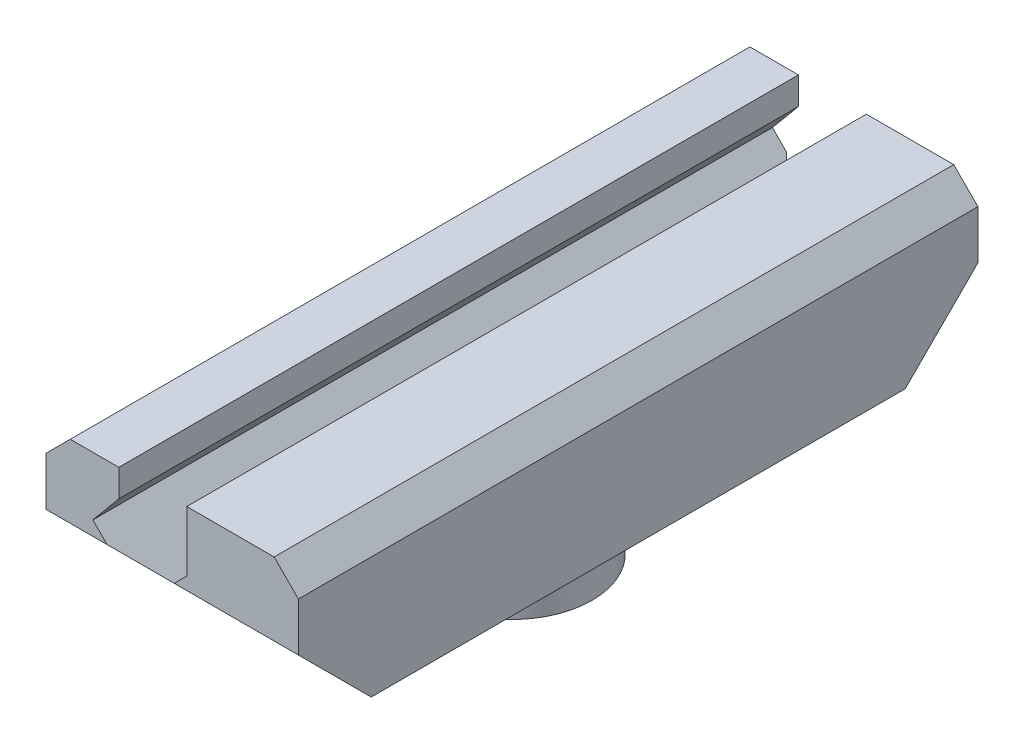
ISO-10303-21;
HEADER;
FILE_DESCRIPTION(('STEP AP214'),'2;1');
FILE_NAME('part.step','',(''),(''),'','','');
FILE_SCHEMA(('AUTOMOTIVE_DESIGN { 1 0 10303 214 1 1 1 1 }'));
ENDSEC;
DATA;
#1=APPLICATION_CONTEXT('core data for automotive mechanical design processes');
#2=APPLICATION_PROTOCOL_DEFINITION('international standard','automotive_design',2000,#1);
#3=PRODUCT_CONTEXT('',#1,'mechanical');
#4=PRODUCT('Part','Part','',(#3));
#5=PRODUCT_RELATED_PRODUCT_CATEGORY('part','',(#4));
#6=PRODUCT_DEFINITION_FORMATION('','',#4);
#7=PRODUCT_DEFINITION_CONTEXT('part definition',#1,'design');
#8=PRODUCT_DEFINITION('design','',#6,#7);
#9=PRODUCT_DEFINITION_SHAPE('','',#8);
#10=(LENGTH_UNIT() NAMED_UNIT(*) SI_UNIT(.MILLI.,.METRE.));
#11=(NAMED_UNIT(*) PLANE_ANGLE_UNIT() SI_UNIT($,.RADIAN.));
#12=(NAMED_UNIT(*) SI_UNIT($,.STERADIAN.) SOLID_ANGLE_UNIT());
#13=UNCERTAINTY_MEASURE_WITH_UNIT(LENGTH_MEASURE(1.E-05),#10,'distance_accuracy_value','');
#14=(GEOMETRIC_REPRESENTATION_CONTEXT(3) GLOBAL_UNCERTAINTY_ASSIGNED_CONTEXT((#13)) GLOBAL_UNIT_ASSIGNED_CONTEXT((#10,
#11,#12)) REPRESENTATION_CONTEXT('',''));
#15=CARTESIAN_POINT('',(0.,0.,0.));
#16=DIRECTION('',(0.,0.,1.));
#17=DIRECTION('',(1.,0.,0.));
#18=AXIS2_PLACEMENT_3D('',#15,#16,#17);
#19=CARTESIAN_POINT('',(102.,-9.,0.));
#20=DIRECTION('',(0.,1.,0.));
#21=DIRECTION('',(1.,0.,0.));
#22=AXIS2_PLACEMENT_3D('',#19,#20,#21);
#23=PLANE('',#22);
#24=CARTESIAN_POINT('',(102.,-9.,0.));
#25=DIRECTION('',(0.,-1.,0.));
#26=DIRECTION('',(0.,0.,1.));
#27=AXIS2_PLACEMENT_3D('',#24,#25,#26);
#28=CIRCLE('',#27,9.9);
#29=CARTESIAN_POINT('',(102.,-9.,-9.9));
#30=VERTEX_POINT('',#29);
#31=EDGE_CURVE('E25',#30,#30,#28,.T.);
#32=ORIENTED_EDGE('',*,*,#31,.T.);
#33=EDGE_LOOP('',(#32));
#34=FACE_BOUND('',#33,.T.);
#35=ADVANCED_FACE('F16',(#34),#23,.F.);
#36=CARTESIAN_POINT('',(102.,0.,0.));
#37=DIRECTION('',(0.,-1.,0.));
#38=DIRECTION('',(0.,0.,1.));
#39=AXIS2_PLACEMENT_3D('',#36,#37,#38);
#40=CYLINDRICAL_SURFACE('',#39,9.9);
#41=ORIENTED_EDGE('',*,*,#31,.F.);
#42=DIRECTION('',(0.,1.,0.));
#43=VECTOR('',#42,1.);
#44=CARTESIAN_POINT('',(102.,0.,-9.9));
#45=LINE('',#44,#43);
#46=CARTESIAN_POINT('',(102.,0.,-9.9));
#47=VERTEX_POINT('',#46);
#48=EDGE_CURVE('E10',#30,#47,#45,.T.);
#49=ORIENTED_EDGE('',*,*,#48,.T.);
#50=CARTESIAN_POINT('',(102.,0.,0.));
#51=DIRECTION('',(0.,1.,0.));
#52=DIRECTION('',(0.,0.,1.));
#53=AXIS2_PLACEMENT_3D('',#50,#51,#52);
#54=CIRCLE('',#53,9.9);
#55=EDGE_CURVE('E206',#47,#47,#54,.T.);
#56=ORIENTED_EDGE('',*,*,#55,.F.);
#57=ORIENTED_EDGE('',*,*,#48,.F.);
#58=EDGE_LOOP('',(#41,#49,#56,#57));
#59=FACE_BOUND('',#58,.T.);
#60=ADVANCED_FACE('F204',(#59),#40,.T.);
#61=CARTESIAN_POINT('',(117.6,0.,-42.));
#62=DIRECTION('',(0.,0.,-1.));
#63=DIRECTION('',(0.,-1.,0.));
#64=AXIS2_PLACEMENT_3D('',#61,#62,#63);
#65=PLANE('',#64);
#66=DIRECTION('',(-0.707106781186548,-0.707106781186548,0.));
#67=VECTOR('',#66,1.);
#68=CARTESIAN_POINT('',(91.2,19.8,-42.));
#69=LINE('',#68,#67);
#70=CARTESIAN_POINT('',(89.4,18.,-42.));
#71=VERTEX_POINT('',#70);
#72=CARTESIAN_POINT('',(86.4,15.,-42.));
#73=VERTEX_POINT('',#72);
#74=EDGE_CURVE('E299',#71,#73,#69,.T.);
#75=ORIENTED_EDGE('',*,*,#74,.F.);
#76=DIRECTION('',(-1.,0.,0.));
#77=VECTOR('',#76,1.);
#78=CARTESIAN_POINT('',(117.6,18.,-42.));
#79=LINE('',#78,#77);
#80=CARTESIAN_POINT('',(95.4,18.0000000894069,-42.));
#81=VERTEX_POINT('',#80);
#82=EDGE_CURVE('E169',#81,#71,#79,.T.);
#83=ORIENTED_EDGE('',*,*,#82,.F.);
#84=DIRECTION('',(0.,-1.,0.));
#85=VECTOR('',#84,1.);
#86=CARTESIAN_POINT('',(95.4,9.00000004470348,-42.));
#87=LINE('',#86,#85);
#88=CARTESIAN_POINT('',(95.4,14.6172300078845,-42.));
#89=VERTEX_POINT('',#88);
#90=EDGE_CURVE('E159',#81,#89,#87,.T.);
#91=ORIENTED_EDGE('',*,*,#90,.T.);
#92=DIRECTION('',(-0.640184404356033,-0.768221275687748,0.));
#93=VECTOR('',#92,1.);
#94=CARTESIAN_POINT('',(96.354779564886,15.7629654715204,-42.));
#95=LINE('',#94,#93);
#96=CARTESIAN_POINT('',(92.1882917710182,10.7631801809648,-42.));
#97=VERTEX_POINT('',#96);
#98=EDGE_CURVE('E167',#89,#97,#95,.T.);
#99=ORIENTED_EDGE('',*,*,#98,.T.);
#100=DIRECTION('',(0.707106781186548,-0.707106781186547,0.));
#101=VECTOR('',#100,1.);
#102=CARTESIAN_POINT('',(101.232013873505,1.71945807847817,-42.));
#103=LINE('',#102,#101);
#104=CARTESIAN_POINT('',(93.9514719519834,9.,-42.));
#105=VERTEX_POINT('',#104);
#106=EDGE_CURVE('E306',#97,#105,#103,.T.);
#107=ORIENTED_EDGE('',*,*,#106,.T.);
#108=DIRECTION('',(1.,0.,0.));
#109=VECTOR('',#108,1.);
#110=CARTESIAN_POINT('',(109.8,9.,-42.));
#111=LINE('',#110,#109);
#112=CARTESIAN_POINT('',(86.4,9.,-42.));
#113=VERTEX_POINT('',#112);
#114=EDGE_CURVE('E215',#113,#105,#111,.T.);
#115=ORIENTED_EDGE('',*,*,#114,.F.);
#116=DIRECTION('',(0.,1.,0.));
#117=VECTOR('',#116,1.);
#118=CARTESIAN_POINT('',(86.4,0.,-42.));
#119=LINE('',#118,#117);
#120=EDGE_CURVE('E317',#113,#73,#119,.T.);
#121=ORIENTED_EDGE('',*,*,#120,.T.);
#122=EDGE_LOOP('',(#75,#83,#91,#99,#107,#115,#121));
#123=FACE_BOUND('',#122,.T.);
#124=ADVANCED_FACE('F162',(#123),#65,.T.);
#125=CARTESIAN_POINT('',(102.,18.,0.));
#126=DIRECTION('',(0.,1.,0.));
#127=DIRECTION('',(1.,0.,0.));
#128=AXIS2_PLACEMENT_3D('',#125,#126,#127);
#129=PLANE('',#128);
#130=DIRECTION('',(0.,0.,-1.));
#131=VECTOR('',#130,1.);
#132=CARTESIAN_POINT('',(89.4,18.,-21.));
#133=LINE('',#132,#131);
#134=CARTESIAN_POINT('',(89.4,18.,42.));
#135=VERTEX_POINT('',#134);
#136=EDGE_CURVE('E304',#135,#71,#133,.T.);
#137=ORIENTED_EDGE('',*,*,#136,.F.);
#138=DIRECTION('',(1.,0.,0.));
#139=VECTOR('',#138,1.);
#140=CARTESIAN_POINT('',(86.4,18.,42.));
#141=LINE('',#140,#139);
#142=CARTESIAN_POINT('',(95.4,18.0000000894069,42.));
#143=VERTEX_POINT('',#142);
#144=EDGE_CURVE('E312',#135,#143,#141,.T.);
#145=ORIENTED_EDGE('',*,*,#144,.T.);
#146=DIRECTION('',(0.,0.,-1.));
#147=VECTOR('',#146,1.);
#148=CARTESIAN_POINT('',(95.4,18.,-21.));
#149=LINE('',#148,#147);
#150=EDGE_CURVE('E172',#143,#81,#149,.T.);
#151=ORIENTED_EDGE('',*,*,#150,.T.);
#152=ORIENTED_EDGE('',*,*,#82,.T.);
#153=EDGE_LOOP('',(#137,#145,#151,#152));
#154=FACE_BOUND('',#153,.T.);
#155=ADVANCED_FACE('F680',(#154),#129,.T.);
#156=CARTESIAN_POINT('',(102.,18.,0.));
#157=DIRECTION('',(0.,1.,0.));
#158=DIRECTION('',(1.,0.,0.));
#159=AXIS2_PLACEMENT_3D('',#156,#157,#158);
#160=PLANE('',#159);
#161=DIRECTION('',(0.,0.,1.));
#162=VECTOR('',#161,1.);
#163=CARTESIAN_POINT('',(114.6,18.,21.));
#164=LINE('',#163,#162);
#165=CARTESIAN_POINT('',(114.6,18.,-42.));
#166=VERTEX_POINT('',#165);
#167=CARTESIAN_POINT('',(114.6,18.,42.));
#168=VERTEX_POINT('',#167);
#169=EDGE_CURVE('E233',#166,#168,#164,.T.);
#170=ORIENTED_EDGE('',*,*,#169,.F.);
#171=DIRECTION('',(-1.,0.,0.));
#172=VECTOR('',#171,1.);
#173=CARTESIAN_POINT('',(117.6,18.,-42.));
#174=LINE('',#173,#172);
#175=CARTESIAN_POINT('',(103.8,18.,-42.));
#176=VERTEX_POINT('',#175);
#177=EDGE_CURVE('E194',#166,#176,#174,.T.);
#178=ORIENTED_EDGE('',*,*,#177,.T.);
#179=DIRECTION('',(0.,0.,1.));
#180=VECTOR('',#179,1.);
#181=CARTESIAN_POINT('',(103.8,18.,-21.));
#182=LINE('',#181,#180);
#183=CARTESIAN_POINT('',(103.8,18.,42.));
#184=VERTEX_POINT('',#183);
#185=EDGE_CURVE('E187',#176,#184,#182,.T.);
#186=ORIENTED_EDGE('',*,*,#185,.T.);
#187=DIRECTION('',(1.,0.,0.));
#188=VECTOR('',#187,1.);
#189=CARTESIAN_POINT('',(86.4,18.,42.));
#190=LINE('',#189,#188);
#191=EDGE_CURVE('E251',#184,#168,#190,.T.);
#192=ORIENTED_EDGE('',*,*,#191,.T.);
#193=EDGE_LOOP('',(#170,#178,#186,#192));
#194=FACE_BOUND('',#193,.T.);
#195=ADVANCED_FACE('F230',(#194),#160,.T.);
#196=CARTESIAN_POINT('',(95.4,18.0000000894069,-42.));
#197=DIRECTION('',(-1.,0.,0.));
#198=DIRECTION('',(0.,0.,1.));
#199=AXIS2_PLACEMENT_3D('',#196,#197,#198);
#200=PLANE('',#199);
#201=ORIENTED_EDGE('',*,*,#90,.F.);
#202=ORIENTED_EDGE('',*,*,#150,.F.);
#203=DIRECTION('',(0.,1.,0.));
#204=VECTOR('',#203,1.);
#205=CARTESIAN_POINT('',(95.4,9.00000004470348,42.));
#206=LINE('',#205,#204);
#207=CARTESIAN_POINT('',(95.4,14.6172300078845,42.));
#208=VERTEX_POINT('',#207);
#209=EDGE_CURVE('E178',#208,#143,#206,.T.);
#210=ORIENTED_EDGE('',*,*,#209,.F.);
#211=DIRECTION('',(0.,0.,1.));
#212=VECTOR('',#211,1.);
#213=CARTESIAN_POINT('',(95.4,14.6172300078845,-42.));
#214=LINE('',#213,#212);
#215=EDGE_CURVE('E174',#89,#208,#214,.T.);
#216=ORIENTED_EDGE('',*,*,#215,.F.);
#217=EDGE_LOOP('',(#201,#202,#210,#216));
#218=FACE_BOUND('',#217,.T.);
#219=ADVANCED_FACE('F176',(#218),#200,.F.);
#220=CARTESIAN_POINT('',(95.4,14.6172300078845,-42.));
#221=DIRECTION('',(-0.768221275687748,0.640184404356033,0.));
#222=DIRECTION('',(0.,0.,1.));
#223=AXIS2_PLACEMENT_3D('',#220,#221,#222);
#224=PLANE('',#223);
#225=ORIENTED_EDGE('',*,*,#98,.F.);
#226=ORIENTED_EDGE('',*,*,#215,.T.);
#227=DIRECTION('',(0.640184404356033,0.768221275687748,0.));
#228=VECTOR('',#227,1.);
#229=CARTESIAN_POINT('',(89.9613368482272,8.0908343067996,42.));
#230=LINE('',#229,#228);
#231=CARTESIAN_POINT('',(92.1882917710182,10.7631801809648,42.));
#232=VERTEX_POINT('',#231);
#233=EDGE_CURVE('E330',#232,#208,#230,.T.);
#234=ORIENTED_EDGE('',*,*,#233,.F.);
#235=DIRECTION('',(0.,0.,1.));
#236=VECTOR('',#235,1.);
#237=CARTESIAN_POINT('',(92.1882917710182,10.7631801809648,-42.));
#238=LINE('',#237,#236);
#239=EDGE_CURVE('E184',#97,#232,#238,.T.);
#240=ORIENTED_EDGE('',*,*,#239,.F.);
#241=EDGE_LOOP('',(#225,#226,#234,#240));
#242=FACE_BOUND('',#241,.T.);
#243=ADVANCED_FACE('F182',(#242),#224,.F.);
#244=CARTESIAN_POINT('',(103.8,10.5514719519832,-42.));
#245=DIRECTION('',(1.,0.,0.));
#246=DIRECTION('',(0.,0.,1.));
#247=AXIS2_PLACEMENT_3D('',#244,#245,#246);
#248=PLANE('',#247);
#249=DIRECTION('',(0.,1.,0.));
#250=VECTOR('',#249,1.);
#251=CARTESIAN_POINT('',(103.8,5.27573597599157,-42.));
#252=LINE('',#251,#250);
#253=CARTESIAN_POINT('',(103.8,10.5514719519832,-42.));
#254=VERTEX_POINT('',#253);
#255=EDGE_CURVE('E211',#254,#176,#252,.T.);
#256=ORIENTED_EDGE('',*,*,#255,.F.);
#257=DIRECTION('',(0.,0.,1.));
#258=VECTOR('',#257,1.);
#259=CARTESIAN_POINT('',(103.8,10.5514719519832,-42.));
#260=LINE('',#259,#258);
#261=CARTESIAN_POINT('',(103.8,10.5514719519832,42.));
#262=VERTEX_POINT('',#261);
#263=EDGE_CURVE('E243',#254,#262,#260,.T.);
#264=ORIENTED_EDGE('',*,*,#263,.T.);
#265=DIRECTION('',(0.,-1.,0.));
#266=VECTOR('',#265,1.);
#267=CARTESIAN_POINT('',(103.8,5.27573597599157,42.));
#268=LINE('',#267,#266);
#269=EDGE_CURVE('E250',#184,#262,#268,.T.);
#270=ORIENTED_EDGE('',*,*,#269,.F.);
#271=ORIENTED_EDGE('',*,*,#185,.F.);
#272=EDGE_LOOP('',(#256,#264,#270,#271));
#273=FACE_BOUND('',#272,.T.);
#274=ADVANCED_FACE('F242',(#273),#248,.F.);
#275=CARTESIAN_POINT('',(117.6,0.,-42.));
#276=DIRECTION('',(0.,0.,-1.));
#277=DIRECTION('',(0.,-1.,0.));
#278=AXIS2_PLACEMENT_3D('',#275,#276,#277);
#279=PLANE('',#278);
#280=DIRECTION('',(-0.707106781186548,0.707106781186548,0.));
#281=VECTOR('',#280,1.);
#282=CARTESIAN_POINT('',(120.6,12.,-42.));
#283=LINE('',#282,#281);
#284=CARTESIAN_POINT('',(117.6,15.,-42.));
#285=VERTEX_POINT('',#284);
#286=EDGE_CURVE('E267',#285,#166,#283,.T.);
#287=ORIENTED_EDGE('',*,*,#286,.F.);
#288=DIRECTION('',(0.,1.,0.));
#289=VECTOR('',#288,1.);
#290=CARTESIAN_POINT('',(117.6,0.,-42.));
#291=LINE('',#290,#289);
#292=CARTESIAN_POINT('',(117.6,9.,-42.));
#293=VERTEX_POINT('',#292);
#294=EDGE_CURVE('E257',#293,#285,#291,.T.);
#295=ORIENTED_EDGE('',*,*,#294,.F.);
#296=DIRECTION('',(1.,0.,0.));
#297=VECTOR('',#296,1.);
#298=CARTESIAN_POINT('',(109.8,9.,-42.));
#299=LINE('',#298,#297);
#300=CARTESIAN_POINT('',(102.248528048017,9.,-42.));
#301=VERTEX_POINT('',#300);
#302=EDGE_CURVE('E379',#301,#293,#299,.T.);
#303=ORIENTED_EDGE('',*,*,#302,.F.);
#304=DIRECTION('',(0.707106781186548,0.707106781186547,0.));
#305=VECTOR('',#304,1.);
#306=CARTESIAN_POINT('',(101.762132012004,8.51360396398734,-42.));
#307=LINE('',#306,#305);
#308=EDGE_CURVE('E239',#301,#254,#307,.T.);
#309=ORIENTED_EDGE('',*,*,#308,.T.);
#310=ORIENTED_EDGE('',*,*,#255,.T.);
#311=ORIENTED_EDGE('',*,*,#177,.F.);
#312=EDGE_LOOP('',(#287,#295,#303,#309,#310,#311));
#313=FACE_BOUND('',#312,.T.);
#314=ADVANCED_FACE('F238',(#313),#279,.T.);
#315=CARTESIAN_POINT('',(102.,0.,0.));
#316=DIRECTION('',(0.,1.,0.));
#317=DIRECTION('',(1.,0.,0.));
#318=AXIS2_PLACEMENT_3D('',#315,#316,#317);
#319=PLANE('',#318);
#320=ORIENTED_EDGE('',*,*,#55,.T.);
#321=EDGE_LOOP('',(#320));
#322=FACE_BOUND('',#321,.T.);
#323=DIRECTION('',(1.,0.,0.));
#324=VECTOR('',#323,1.);
#325=CARTESIAN_POINT('',(94.2,0.,33.));
#326=LINE('',#325,#324);
#327=CARTESIAN_POINT('',(86.4,0.,33.));
#328=VERTEX_POINT('',#327);
#329=CARTESIAN_POINT('',(117.6,0.,33.));
#330=VERTEX_POINT('',#329);
#331=EDGE_CURVE('E356',#328,#330,#326,.T.);
#332=ORIENTED_EDGE('',*,*,#331,.F.);
#333=DIRECTION('',(0.,0.,1.));
#334=VECTOR('',#333,1.);
#335=CARTESIAN_POINT('',(86.4,0.,-42.));
#336=LINE('',#335,#334);
#337=CARTESIAN_POINT('',(86.4,0.,-33.));
#338=VERTEX_POINT('',#337);
#339=EDGE_CURVE('E337',#338,#328,#336,.T.);
#340=ORIENTED_EDGE('',*,*,#339,.F.);
#341=DIRECTION('',(-1.,0.,0.));
#342=VECTOR('',#341,1.);
#343=CARTESIAN_POINT('',(109.8,0.,-33.));
#344=LINE('',#343,#342);
#345=CARTESIAN_POINT('',(117.6,0.,-33.));
#346=VERTEX_POINT('',#345);
#347=EDGE_CURVE('E219',#346,#338,#344,.T.);
#348=ORIENTED_EDGE('',*,*,#347,.F.);
#349=DIRECTION('',(0.,0.,-1.));
#350=VECTOR('',#349,1.);
#351=CARTESIAN_POINT('',(117.6,0.,42.));
#352=LINE('',#351,#350);
#353=EDGE_CURVE('E272',#330,#346,#352,.T.);
#354=ORIENTED_EDGE('',*,*,#353,.F.);
#355=EDGE_LOOP('',(#332,#340,#348,#354));
#356=FACE_BOUND('',#355,.T.);
#357=ADVANCED_FACE('F208',(#322,#356),#319,.F.);
#358=CARTESIAN_POINT('',(109.8,4.5,-37.5));
#359=DIRECTION('',(0.,-0.707106781186548,-0.707106781186548));
#360=DIRECTION('',(0.,-0.707106781186548,0.707106781186548));
#361=AXIS2_PLACEMENT_3D('',#358,#359,#360);
#362=PLANE('',#361);
#363=DIRECTION('',(0.577350269189627,0.577350269189626,-0.577350269189625));
#364=VECTOR('',#363,1.);
#365=CARTESIAN_POINT('',(100.624264024009,7.37573597599158,-40.3757359759917));
#366=LINE('',#365,#364);
#367=CARTESIAN_POINT('',(98.1,4.85147195198314,-37.8514719519832));
#368=VERTEX_POINT('',#367);
#369=EDGE_CURVE('E362',#368,#301,#366,.T.);
#370=ORIENTED_EDGE('',*,*,#369,.T.);
#371=ORIENTED_EDGE('',*,*,#302,.T.);
#372=DIRECTION('',(0.,-0.707106781186548,0.707106781186548));
#373=VECTOR('',#372,1.);
#374=CARTESIAN_POINT('',(117.6,-16.5,-16.5));
#375=LINE('',#374,#373);
#376=EDGE_CURVE('E266',#293,#346,#375,.T.);
#377=ORIENTED_EDGE('',*,*,#376,.T.);
#378=ORIENTED_EDGE('',*,*,#347,.T.);
#379=DIRECTION('',(0.,0.707106781186548,-0.707106781186548));
#380=VECTOR('',#379,1.);
#381=CARTESIAN_POINT('',(86.4,4.5,-37.5));
#382=LINE('',#381,#380);
#383=EDGE_CURVE('E345',#338,#113,#382,.T.);
#384=ORIENTED_EDGE('',*,*,#383,.T.);
#385=ORIENTED_EDGE('',*,*,#114,.T.);
#386=DIRECTION('',(0.577350269189626,-0.577350269189626,0.577350269189626));
#387=VECTOR('',#386,1.);
#388=CARTESIAN_POINT('',(97.505166566331,5.44630538565211,-38.4463053856522));
#389=LINE('',#388,#387);
#390=EDGE_CURVE('E369',#105,#368,#389,.T.);
#391=ORIENTED_EDGE('',*,*,#390,.T.);
#392=EDGE_LOOP('',(#370,#371,#377,#378,#384,#385,#391));
#393=FACE_BOUND('',#392,.T.);
#394=ADVANCED_FACE('F390',(#393),#362,.T.);
#395=CARTESIAN_POINT('',(98.1,4.85147195198314,-42.));
#396=DIRECTION('',(0.707106781186547,-0.707106781186548,0.));
#397=DIRECTION('',(0.,0.,-1.));
#398=AXIS2_PLACEMENT_3D('',#395,#396,#397);
#399=PLANE('',#398);
#400=DIRECTION('',(-0.577350269189626,-0.577350269189626,-0.577350269189625));
#401=VECTOR('',#400,1.);
#402=CARTESIAN_POINT('',(84.0242640240084,-9.22426402400844,23.7757359759915));
#403=LINE('',#402,#401);
#404=CARTESIAN_POINT('',(102.248528048017,9.,42.));
#405=VERTEX_POINT('',#404);
#406=CARTESIAN_POINT('',(98.1,4.85147195198314,37.8514719519831));
#407=VERTEX_POINT('',#406);
#408=EDGE_CURVE('E357',#405,#407,#403,.T.);
#409=ORIENTED_EDGE('',*,*,#408,.F.);
#410=DIRECTION('',(-0.707106781186548,-0.707106781186547,0.));
#411=VECTOR('',#410,1.);
#412=CARTESIAN_POINT('',(93.962132012004,0.713603963987358,42.));
#413=LINE('',#412,#411);
#414=EDGE_CURVE('E252',#262,#405,#413,.T.);
#415=ORIENTED_EDGE('',*,*,#414,.F.);
#416=ORIENTED_EDGE('',*,*,#263,.F.);
#417=ORIENTED_EDGE('',*,*,#308,.F.);
#418=ORIENTED_EDGE('',*,*,#369,.F.);
#419=DIRECTION('',(0.,0.,1.));
#420=VECTOR('',#419,1.);
#421=CARTESIAN_POINT('',(98.1,4.85147195198314,-42.));
#422=LINE('',#421,#420);
#423=EDGE_CURVE('E368',#368,#407,#422,.T.);
#424=ORIENTED_EDGE('',*,*,#423,.T.);
#425=EDGE_LOOP('',(#409,#415,#416,#417,#418,#424));
#426=FACE_BOUND('',#425,.T.);
#427=ADVANCED_FACE('F403',(#426),#399,.F.);
#428=CARTESIAN_POINT('',(92.1882917710182,10.7631801809648,-42.));
#429=DIRECTION('',(-0.707106781186547,-0.707106781186548,0.));
#430=DIRECTION('',(-0.707106781186548,0.707106781186547,0.));
#431=AXIS2_PLACEMENT_3D('',#428,#429,#430);
#432=PLANE('',#431);
#433=DIRECTION('',(-0.577350269189626,0.577350269189626,0.577350269189625));
#434=VECTOR('',#433,1.);
#435=CARTESIAN_POINT('',(108.905166566331,-5.95369461434788,27.0463053856521));
#436=LINE('',#435,#434);
#437=CARTESIAN_POINT('',(93.9514719519834,9.,42.));
#438=VERTEX_POINT('',#437);
#439=EDGE_CURVE('E352',#407,#438,#436,.T.);
#440=ORIENTED_EDGE('',*,*,#439,.F.);
#441=ORIENTED_EDGE('',*,*,#423,.F.);
#442=ORIENTED_EDGE('',*,*,#390,.F.);
#443=ORIENTED_EDGE('',*,*,#106,.F.);
#444=ORIENTED_EDGE('',*,*,#239,.T.);
#445=DIRECTION('',(-0.707106781186548,0.707106781186547,0.));
#446=VECTOR('',#445,1.);
#447=CARTESIAN_POINT('',(93.4320138735048,9.51945807847818,42.));
#448=LINE('',#447,#446);
#449=EDGE_CURVE('E329',#438,#232,#448,.T.);
#450=ORIENTED_EDGE('',*,*,#449,.F.);
#451=EDGE_LOOP('',(#440,#441,#442,#443,#444,#450));
#452=FACE_BOUND('',#451,.T.);
#453=ADVANCED_FACE('F397',(#452),#432,.F.);
#454=CARTESIAN_POINT('',(94.2,4.5,37.5));
#455=DIRECTION('',(0.,-0.707106781186547,0.707106781186548));
#456=DIRECTION('',(-1.,0.,0.));
#457=AXIS2_PLACEMENT_3D('',#454,#455,#456);
#458=PLANE('',#457);
#459=ORIENTED_EDGE('',*,*,#439,.T.);
#460=DIRECTION('',(-1.,0.,0.));
#461=VECTOR('',#460,1.);
#462=CARTESIAN_POINT('',(94.2,9.,42.));
#463=LINE('',#462,#461);
#464=CARTESIAN_POINT('',(86.4,9.,42.));
#465=VERTEX_POINT('',#464);
#466=EDGE_CURVE('E326',#438,#465,#463,.T.);
#467=ORIENTED_EDGE('',*,*,#466,.T.);
#468=DIRECTION('',(0.,-0.707106781186548,-0.707106781186547));
#469=VECTOR('',#468,1.);
#470=CARTESIAN_POINT('',(86.4,-16.5,16.5));
#471=LINE('',#470,#469);
#472=EDGE_CURVE('E341',#465,#328,#471,.T.);
#473=ORIENTED_EDGE('',*,*,#472,.T.);
#474=ORIENTED_EDGE('',*,*,#331,.T.);
#475=DIRECTION('',(0.,0.707106781186548,0.707106781186547));
#476=VECTOR('',#475,1.);
#477=CARTESIAN_POINT('',(117.6,4.5,37.5));
#478=LINE('',#477,#476);
#479=CARTESIAN_POINT('',(117.6,9.,42.));
#480=VERTEX_POINT('',#479);
#481=EDGE_CURVE('E280',#330,#480,#478,.T.);
#482=ORIENTED_EDGE('',*,*,#481,.T.);
#483=DIRECTION('',(-1.,0.,0.));
#484=VECTOR('',#483,1.);
#485=CARTESIAN_POINT('',(94.2,9.,42.));
#486=LINE('',#485,#484);
#487=EDGE_CURVE('E285',#480,#405,#486,.T.);
#488=ORIENTED_EDGE('',*,*,#487,.T.);
#489=ORIENTED_EDGE('',*,*,#408,.T.);
#490=EDGE_LOOP('',(#459,#467,#473,#474,#482,#488,#489));
#491=FACE_BOUND('',#490,.T.);
#492=ADVANCED_FACE('F404',(#491),#458,.T.);
#493=CARTESIAN_POINT('',(86.4,0.,-42.));
#494=DIRECTION('',(-1.,0.,0.));
#495=DIRECTION('',(0.,0.,1.));
#496=AXIS2_PLACEMENT_3D('',#493,#494,#495);
#497=PLANE('',#496);
#498=DIRECTION('',(0.,0.,1.));
#499=VECTOR('',#498,1.);
#500=CARTESIAN_POINT('',(86.4,15.,-21.));
#501=LINE('',#500,#499);
#502=CARTESIAN_POINT('',(86.4,15.,42.));
#503=VERTEX_POINT('',#502);
#504=EDGE_CURVE('E302',#73,#503,#501,.T.);
#505=ORIENTED_EDGE('',*,*,#504,.F.);
#506=ORIENTED_EDGE('',*,*,#120,.F.);
#507=ORIENTED_EDGE('',*,*,#383,.F.);
#508=ORIENTED_EDGE('',*,*,#339,.T.);
#509=ORIENTED_EDGE('',*,*,#472,.F.);
#510=DIRECTION('',(0.,1.,0.));
#511=VECTOR('',#510,1.);
#512=CARTESIAN_POINT('',(86.4,0.,42.));
#513=LINE('',#512,#511);
#514=EDGE_CURVE('E323',#465,#503,#513,.T.);
#515=ORIENTED_EDGE('',*,*,#514,.T.);
#516=EDGE_LOOP('',(#505,#506,#507,#508,#509,#515));
#517=FACE_BOUND('',#516,.T.);
#518=ADVANCED_FACE('F393',(#517),#497,.T.);
#519=CARTESIAN_POINT('',(86.4,0.,42.));
#520=DIRECTION('',(0.,0.,1.));
#521=DIRECTION('',(1.,0.,0.));
#522=AXIS2_PLACEMENT_3D('',#519,#520,#521);
#523=PLANE('',#522);
#524=DIRECTION('',(0.707106781186548,0.707106781186548,0.));
#525=VECTOR('',#524,1.);
#526=CARTESIAN_POINT('',(83.4,12.,42.));
#527=LINE('',#526,#525);
#528=EDGE_CURVE('E287',#503,#135,#527,.T.);
#529=ORIENTED_EDGE('',*,*,#528,.F.);
#530=ORIENTED_EDGE('',*,*,#514,.F.);
#531=ORIENTED_EDGE('',*,*,#466,.F.);
#532=ORIENTED_EDGE('',*,*,#449,.T.);
#533=ORIENTED_EDGE('',*,*,#233,.T.);
#534=ORIENTED_EDGE('',*,*,#209,.T.);
#535=ORIENTED_EDGE('',*,*,#144,.F.);
#536=EDGE_LOOP('',(#529,#530,#531,#532,#533,#534,#535));
#537=FACE_BOUND('',#536,.T.);
#538=ADVANCED_FACE('F619',(#537),#523,.T.);
#539=CARTESIAN_POINT('',(87.9,16.5,-21.));
#540=DIRECTION('',(-0.707106781186548,0.707106781186548,0.));
#541=DIRECTION('',(0.,0.,1.));
#542=AXIS2_PLACEMENT_3D('',#539,#540,#541);
#543=PLANE('',#542);
#544=ORIENTED_EDGE('',*,*,#528,.T.);
#545=ORIENTED_EDGE('',*,*,#136,.T.);
#546=ORIENTED_EDGE('',*,*,#74,.T.);
#547=ORIENTED_EDGE('',*,*,#504,.T.);
#548=EDGE_LOOP('',(#544,#545,#546,#547));
#549=FACE_BOUND('',#548,.T.);
#550=ADVANCED_FACE('F582',(#549),#543,.T.);
#551=CARTESIAN_POINT('',(86.4,0.,42.));
#552=DIRECTION('',(0.,0.,1.));
#553=DIRECTION('',(1.,0.,0.));
#554=AXIS2_PLACEMENT_3D('',#551,#552,#553);
#555=PLANE('',#554);
#556=DIRECTION('',(0.707106781186548,-0.707106781186548,0.));
#557=VECTOR('',#556,1.);
#558=CARTESIAN_POINT('',(112.8,19.8,42.));
#559=LINE('',#558,#557);
#560=CARTESIAN_POINT('',(117.6,15.,42.));
#561=VERTEX_POINT('',#560);
#562=EDGE_CURVE('E256',#168,#561,#559,.T.);
#563=ORIENTED_EDGE('',*,*,#562,.F.);
#564=ORIENTED_EDGE('',*,*,#191,.F.);
#565=ORIENTED_EDGE('',*,*,#269,.T.);
#566=ORIENTED_EDGE('',*,*,#414,.T.);
#567=ORIENTED_EDGE('',*,*,#487,.F.);
#568=DIRECTION('',(0.,1.,0.));
#569=VECTOR('',#568,1.);
#570=CARTESIAN_POINT('',(117.6,0.,42.));
#571=LINE('',#570,#569);
#572=EDGE_CURVE('E283',#480,#561,#571,.T.);
#573=ORIENTED_EDGE('',*,*,#572,.T.);
#574=EDGE_LOOP('',(#563,#564,#565,#566,#567,#573));
#575=FACE_BOUND('',#574,.T.);
#576=ADVANCED_FACE('F258',(#575),#555,.T.);
#577=CARTESIAN_POINT('',(117.6,0.,42.));
#578=DIRECTION('',(1.,0.,0.));
#579=DIRECTION('',(0.,0.,1.));
#580=AXIS2_PLACEMENT_3D('',#577,#578,#579);
#581=PLANE('',#580);
#582=DIRECTION('',(0.,0.,-1.));
#583=VECTOR('',#582,1.);
#584=CARTESIAN_POINT('',(117.6,15.,21.));
#585=LINE('',#584,#583);
#586=EDGE_CURVE('E278',#561,#285,#585,.T.);
#587=ORIENTED_EDGE('',*,*,#586,.F.);
#588=ORIENTED_EDGE('',*,*,#572,.F.);
#589=ORIENTED_EDGE('',*,*,#481,.F.);
#590=ORIENTED_EDGE('',*,*,#353,.T.);
#591=ORIENTED_EDGE('',*,*,#376,.F.);
#592=ORIENTED_EDGE('',*,*,#294,.T.);
#593=EDGE_LOOP('',(#587,#588,#589,#590,#591,#592));
#594=FACE_BOUND('',#593,.T.);
#595=ADVANCED_FACE('F411',(#594),#581,.T.);
#596=CARTESIAN_POINT('',(116.1,16.5,21.));
#597=DIRECTION('',(0.707106781186548,0.707106781186548,0.));
#598=DIRECTION('',(0.,0.,-1.));
#599=AXIS2_PLACEMENT_3D('',#596,#597,#598);
#600=PLANE('',#599);
#601=ORIENTED_EDGE('',*,*,#286,.T.);
#602=ORIENTED_EDGE('',*,*,#169,.T.);
#603=ORIENTED_EDGE('',*,*,#562,.T.);
#604=ORIENTED_EDGE('',*,*,#586,.T.);
#605=EDGE_LOOP('',(#601,#602,#603,#604));
#606=FACE_BOUND('',#605,.T.);
#607=ADVANCED_FACE('F412',(#606),#600,.T.);
#608=CLOSED_SHELL('',(#35,#60,#124,#155,#195,#219,#243,#274,#314,#357,#394,#427,#453,#492,#518,
#538,#550,#576,#595,#607));
#609=MANIFOLD_SOLID_BREP('B1',#608);
#610=ADVANCED_BREP_SHAPE_REPRESENTATION('',(#18,#609),#14);
#611=SHAPE_DEFINITION_REPRESENTATION(#9,#610);
ENDSEC;
END-ISO-10303-21;
